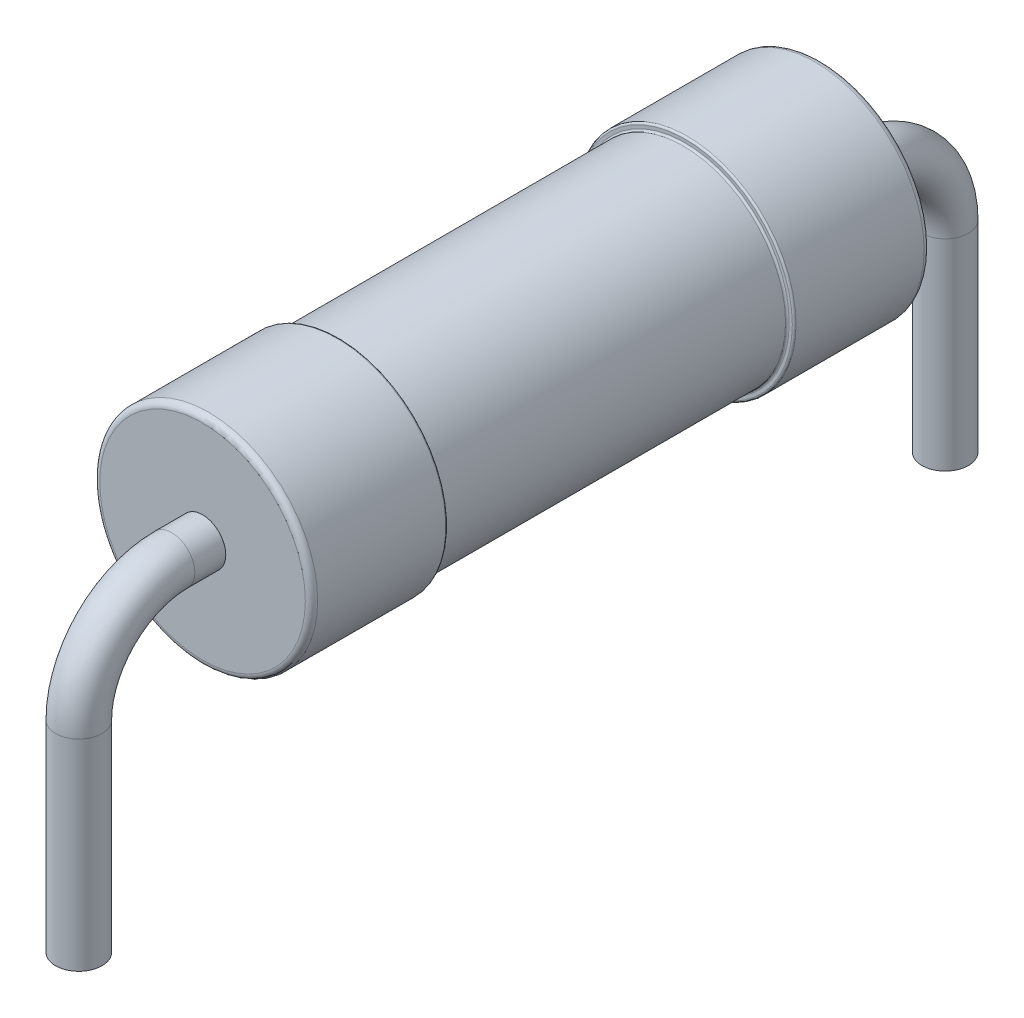
ISO-10303-21;
HEADER;
FILE_DESCRIPTION(('STEP AP214'),'2;1');
FILE_NAME('part.step','',(''),(''),'','','');
FILE_SCHEMA(('AUTOMOTIVE_DESIGN { 1 0 10303 214 1 1 1 1 }'));
ENDSEC;
DATA;
#1=APPLICATION_CONTEXT('core data for automotive mechanical design processes');
#2=APPLICATION_PROTOCOL_DEFINITION('international standard','automotive_design',2000,#1);
#3=PRODUCT_CONTEXT('',#1,'mechanical');
#4=PRODUCT('Part','Part','',(#3));
#5=PRODUCT_RELATED_PRODUCT_CATEGORY('part','',(#4));
#6=PRODUCT_DEFINITION_FORMATION('','',#4);
#7=PRODUCT_DEFINITION_CONTEXT('part definition',#1,'design');
#8=PRODUCT_DEFINITION('design','',#6,#7);
#9=PRODUCT_DEFINITION_SHAPE('','',#8);
#10=(LENGTH_UNIT() NAMED_UNIT(*) SI_UNIT(.MILLI.,.METRE.));
#11=(NAMED_UNIT(*) PLANE_ANGLE_UNIT() SI_UNIT($,.RADIAN.));
#12=(NAMED_UNIT(*) SI_UNIT($,.STERADIAN.) SOLID_ANGLE_UNIT());
#13=UNCERTAINTY_MEASURE_WITH_UNIT(LENGTH_MEASURE(1.E-05),#10,'distance_accuracy_value','');
#14=(GEOMETRIC_REPRESENTATION_CONTEXT(3) GLOBAL_UNCERTAINTY_ASSIGNED_CONTEXT((#13)) GLOBAL_UNIT_ASSIGNED_CONTEXT((#10,
#11,#12)) REPRESENTATION_CONTEXT('',''));
#15=CARTESIAN_POINT('',(0.,0.,0.));
#16=DIRECTION('',(0.,0.,1.));
#17=DIRECTION('',(1.,0.,0.));
#18=AXIS2_PLACEMENT_3D('',#15,#16,#17);
#19=CARTESIAN_POINT('',(0.,0.,5.));
#20=DIRECTION('',(0.,0.,-1.));
#21=DIRECTION('',(-1.,0.,0.));
#22=AXIS2_PLACEMENT_3D('',#19,#20,#21);
#23=CYLINDRICAL_SURFACE('',#22,1.76);
#24=CARTESIAN_POINT('',(0.,0.,2.83));
#25=DIRECTION('',(0.,0.,-1.));
#26=DIRECTION('',(-1.,0.,0.));
#27=AXIS2_PLACEMENT_3D('',#24,#25,#26);
#28=CIRCLE('',#27,1.76);
#29=CARTESIAN_POINT('',(-1.76,0.,2.83));
#30=VERTEX_POINT('',#29);
#31=EDGE_CURVE('E55',#30,#30,#28,.F.);
#32=ORIENTED_EDGE('',*,*,#31,.T.);
#33=EDGE_LOOP('',(#32));
#34=FACE_BOUND('',#33,.T.);
#35=CARTESIAN_POINT('',(0.,0.,4.9));
#36=DIRECTION('',(0.,0.,1.));
#37=DIRECTION('',(1.,0.,0.));
#38=AXIS2_PLACEMENT_3D('',#35,#36,#37);
#39=CIRCLE('',#38,1.76);
#40=CARTESIAN_POINT('',(1.76,0.,4.9));
#41=VERTEX_POINT('',#40);
#42=EDGE_CURVE('E83',#41,#41,#39,.F.);
#43=ORIENTED_EDGE('',*,*,#42,.T.);
#44=EDGE_LOOP('',(#43));
#45=FACE_BOUND('',#44,.T.);
#46=ADVANCED_FACE('F48',(#34,#45),#23,.T.);
#47=CARTESIAN_POINT('',(0.,0.,5.));
#48=DIRECTION('',(0.,0.,1.));
#49=DIRECTION('',(1.,0.,0.));
#50=AXIS2_PLACEMENT_3D('',#47,#48,#49);
#51=PLANE('',#50);
#52=CARTESIAN_POINT('',(0.,0.,5.));
#53=DIRECTION('',(0.,0.,1.));
#54=DIRECTION('',(1.,0.,0.));
#55=AXIS2_PLACEMENT_3D('',#52,#53,#54);
#56=CIRCLE('',#55,0.375);
#57=CARTESIAN_POINT('',(0.375,0.,5.));
#58=VERTEX_POINT('',#57);
#59=EDGE_CURVE('E95',#58,#58,#56,.F.);
#60=ORIENTED_EDGE('',*,*,#59,.T.);
#61=EDGE_LOOP('',(#60));
#62=FACE_BOUND('',#61,.T.);
#63=CARTESIAN_POINT('',(0.,0.,5.));
#64=DIRECTION('',(0.,0.,1.));
#65=DIRECTION('',(1.,0.,0.));
#66=AXIS2_PLACEMENT_3D('',#63,#64,#65);
#67=CIRCLE('',#66,1.66);
#68=CARTESIAN_POINT('',(1.66,0.,5.));
#69=VERTEX_POINT('',#68);
#70=EDGE_CURVE('E86',#69,#69,#67,.T.);
#71=ORIENTED_EDGE('',*,*,#70,.T.);
#72=EDGE_LOOP('',(#71));
#73=FACE_BOUND('',#72,.T.);
#74=ADVANCED_FACE('F134',(#62,#73),#51,.T.);
#75=CARTESIAN_POINT('',(0.,2.59634607125077,2.8));
#76=DIRECTION('',(0.,0.,-1.));
#77=DIRECTION('',(-1.,0.,0.));
#78=AXIS2_PLACEMENT_3D('',#75,#76,#77);
#79=PLANE('',#78);
#80=CARTESIAN_POINT('',(0.,0.,2.8));
#81=DIRECTION('',(0.,0.,-1.));
#82=DIRECTION('',(-1.,0.,0.));
#83=AXIS2_PLACEMENT_3D('',#80,#81,#82);
#84=CIRCLE('',#83,1.68);
#85=CARTESIAN_POINT('',(-1.68,0.,2.8));
#86=VERTEX_POINT('',#85);
#87=EDGE_CURVE('E59',#86,#86,#84,.F.);
#88=ORIENTED_EDGE('',*,*,#87,.T.);
#89=EDGE_LOOP('',(#88));
#90=FACE_BOUND('',#89,.T.);
#91=CARTESIAN_POINT('',(0.,0.,2.8));
#92=DIRECTION('',(0.,0.,-1.));
#93=DIRECTION('',(-1.,0.,0.));
#94=AXIS2_PLACEMENT_3D('',#91,#92,#93);
#95=CIRCLE('',#94,1.73);
#96=CARTESIAN_POINT('',(-1.73,0.,2.8));
#97=VERTEX_POINT('',#96);
#98=EDGE_CURVE('E63',#97,#97,#95,.T.);
#99=ORIENTED_EDGE('',*,*,#98,.T.);
#100=EDGE_LOOP('',(#99));
#101=FACE_BOUND('',#100,.T.);
#102=ADVANCED_FACE('F142',(#90,#101),#79,.T.);
#103=CARTESIAN_POINT('',(0.,2.59634607125077,-2.8));
#104=DIRECTION('',(0.,0.,1.));
#105=DIRECTION('',(1.,0.,0.));
#106=AXIS2_PLACEMENT_3D('',#103,#104,#105);
#107=PLANE('',#106);
#108=CARTESIAN_POINT('',(0.,0.,-2.8));
#109=DIRECTION('',(0.,0.,1.));
#110=DIRECTION('',(1.,0.,0.));
#111=AXIS2_PLACEMENT_3D('',#108,#109,#110);
#112=CIRCLE('',#111,1.73);
#113=CARTESIAN_POINT('',(1.73,0.,-2.8));
#114=VERTEX_POINT('',#113);
#115=EDGE_CURVE('E77',#114,#114,#112,.T.);
#116=ORIENTED_EDGE('',*,*,#115,.T.);
#117=EDGE_LOOP('',(#116));
#118=FACE_BOUND('',#117,.T.);
#119=CARTESIAN_POINT('',(0.,0.,-2.8));
#120=DIRECTION('',(0.,0.,1.));
#121=DIRECTION('',(1.,0.,0.));
#122=AXIS2_PLACEMENT_3D('',#119,#120,#121);
#123=CIRCLE('',#122,1.68);
#124=CARTESIAN_POINT('',(1.68,0.,-2.8));
#125=VERTEX_POINT('',#124);
#126=EDGE_CURVE('E80',#125,#125,#123,.F.);
#127=ORIENTED_EDGE('',*,*,#126,.T.);
#128=EDGE_LOOP('',(#127));
#129=FACE_BOUND('',#128,.T.);
#130=ADVANCED_FACE('F173',(#118,#129),#107,.T.);
#131=CARTESIAN_POINT('',(0.,0.,6.40046315614743));
#132=DIRECTION('',(0.,0.,1.));
#133=DIRECTION('',(1.,0.,0.));
#134=AXIS2_PLACEMENT_3D('',#131,#132,#133);
#135=CYLINDRICAL_SURFACE('',#134,1.65);
#136=CARTESIAN_POINT('',(0.,0.,-2.77));
#137=DIRECTION('',(0.,0.,1.));
#138=DIRECTION('',(1.,0.,0.));
#139=AXIS2_PLACEMENT_3D('',#136,#137,#138);
#140=CIRCLE('',#139,1.65);
#141=CARTESIAN_POINT('',(1.65,0.,-2.77));
#142=VERTEX_POINT('',#141);
#143=EDGE_CURVE('E68',#142,#142,#140,.T.);
#144=ORIENTED_EDGE('',*,*,#143,.T.);
#145=EDGE_LOOP('',(#144));
#146=FACE_BOUND('',#145,.T.);
#147=CARTESIAN_POINT('',(0.,0.,2.77));
#148=DIRECTION('',(0.,0.,-1.));
#149=DIRECTION('',(-1.,0.,0.));
#150=AXIS2_PLACEMENT_3D('',#147,#148,#149);
#151=CIRCLE('',#150,1.65);
#152=CARTESIAN_POINT('',(-1.65,0.,2.77));
#153=VERTEX_POINT('',#152);
#154=EDGE_CURVE('E71',#153,#153,#151,.T.);
#155=ORIENTED_EDGE('',*,*,#154,.T.);
#156=EDGE_LOOP('',(#155));
#157=FACE_BOUND('',#156,.T.);
#158=ADVANCED_FACE('F160',(#146,#157),#135,.T.);
#159=CARTESIAN_POINT('',(0.,0.,-5.));
#160=DIRECTION('',(0.,0.,1.));
#161=DIRECTION('',(1.,0.,0.));
#162=AXIS2_PLACEMENT_3D('',#159,#160,#161);
#163=PLANE('',#162);
#164=CARTESIAN_POINT('',(0.,0.,-5.));
#165=DIRECTION('',(0.,0.,1.));
#166=DIRECTION('',(1.,0.,0.));
#167=AXIS2_PLACEMENT_3D('',#164,#165,#166);
#168=CIRCLE('',#167,0.375);
#169=CARTESIAN_POINT('',(0.375,0.,-5.));
#170=VERTEX_POINT('',#169);
#171=EDGE_CURVE('E11',#170,#170,#168,.F.);
#172=ORIENTED_EDGE('',*,*,#171,.F.);
#173=EDGE_LOOP('',(#172));
#174=FACE_BOUND('',#173,.T.);
#175=CARTESIAN_POINT('',(0.,0.,-5.));
#176=DIRECTION('',(0.,0.,1.));
#177=DIRECTION('',(1.,0.,0.));
#178=AXIS2_PLACEMENT_3D('',#175,#176,#177);
#179=CIRCLE('',#178,1.66);
#180=CARTESIAN_POINT('',(1.66,0.,-5.));
#181=VERTEX_POINT('',#180);
#182=EDGE_CURVE('E89',#181,#181,#179,.F.);
#183=ORIENTED_EDGE('',*,*,#182,.T.);
#184=EDGE_LOOP('',(#183));
#185=FACE_BOUND('',#184,.T.);
#186=ADVANCED_FACE('F150',(#174,#185),#163,.F.);
#187=CARTESIAN_POINT('',(0.,0.,-2.83));
#188=DIRECTION('',(0.,0.,1.));
#189=DIRECTION('',(1.,0.,0.));
#190=AXIS2_PLACEMENT_3D('',#187,#188,#189);
#191=CIRCLE('',#190,1.76);
#192=CARTESIAN_POINT('',(1.76,0.,-2.83));
#193=VERTEX_POINT('',#192);
#194=EDGE_CURVE('E74',#193,#193,#191,.F.);
#195=ORIENTED_EDGE('',*,*,#194,.T.);
#196=EDGE_LOOP('',(#195));
#197=FACE_BOUND('',#196,.T.);
#198=CARTESIAN_POINT('',(0.,0.,-4.9));
#199=DIRECTION('',(0.,0.,1.));
#200=DIRECTION('',(1.,0.,0.));
#201=AXIS2_PLACEMENT_3D('',#198,#199,#200);
#202=CIRCLE('',#201,1.76);
#203=CARTESIAN_POINT('',(1.76,0.,-4.9));
#204=VERTEX_POINT('',#203);
#205=EDGE_CURVE('E92',#204,#204,#202,.T.);
#206=ORIENTED_EDGE('',*,*,#205,.T.);
#207=EDGE_LOOP('',(#206));
#208=FACE_BOUND('',#207,.T.);
#209=ADVANCED_FACE('F136',(#197,#208),#23,.T.);
#210=CARTESIAN_POINT('',(0.,0.,-4.9));
#211=DIRECTION('',(0.,0.,1.));
#212=DIRECTION('',(1.,0.,0.));
#213=AXIS2_PLACEMENT_3D('',#210,#211,#212);
#214=TOROIDAL_SURFACE('',#213,1.66,0.1);
#215=ORIENTED_EDGE('',*,*,#182,.F.);
#216=EDGE_LOOP('',(#215));
#217=FACE_BOUND('',#216,.T.);
#218=ORIENTED_EDGE('',*,*,#205,.F.);
#219=EDGE_LOOP('',(#218));
#220=FACE_BOUND('',#219,.T.);
#221=ADVANCED_FACE('F149',(#217,#220),#214,.T.);
#222=CARTESIAN_POINT('',(0.,0.,4.9));
#223=DIRECTION('',(0.,0.,1.));
#224=DIRECTION('',(1.,0.,0.));
#225=AXIS2_PLACEMENT_3D('',#222,#223,#224);
#226=TOROIDAL_SURFACE('',#225,1.66,0.1);
#227=ORIENTED_EDGE('',*,*,#42,.F.);
#228=EDGE_LOOP('',(#227));
#229=FACE_BOUND('',#228,.T.);
#230=ORIENTED_EDGE('',*,*,#70,.F.);
#231=EDGE_LOOP('',(#230));
#232=FACE_BOUND('',#231,.T.);
#233=ADVANCED_FACE('F157',(#229,#232),#226,.T.);
#234=CARTESIAN_POINT('',(0.,0.,-2.83));
#235=DIRECTION('',(0.,0.,1.));
#236=DIRECTION('',(1.,0.,0.));
#237=AXIS2_PLACEMENT_3D('',#234,#235,#236);
#238=TOROIDAL_SURFACE('',#237,1.73,0.03);
#239=ORIENTED_EDGE('',*,*,#194,.F.);
#240=EDGE_LOOP('',(#239));
#241=FACE_BOUND('',#240,.T.);
#242=ORIENTED_EDGE('',*,*,#115,.F.);
#243=EDGE_LOOP('',(#242));
#244=FACE_BOUND('',#243,.T.);
#245=ADVANCED_FACE('F167',(#241,#244),#238,.T.);
#246=CARTESIAN_POINT('',(0.,0.,-2.77));
#247=DIRECTION('',(0.,0.,1.));
#248=DIRECTION('',(1.,0.,0.));
#249=AXIS2_PLACEMENT_3D('',#246,#247,#248);
#250=TOROIDAL_SURFACE('',#249,1.68,0.03);
#251=ORIENTED_EDGE('',*,*,#126,.F.);
#252=EDGE_LOOP('',(#251));
#253=FACE_BOUND('',#252,.T.);
#254=ORIENTED_EDGE('',*,*,#143,.F.);
#255=EDGE_LOOP('',(#254));
#256=FACE_BOUND('',#255,.T.);
#257=ADVANCED_FACE('F169',(#253,#256),#250,.F.);
#258=CARTESIAN_POINT('',(0.,0.,2.77));
#259=DIRECTION('',(0.,0.,-1.));
#260=DIRECTION('',(-1.,0.,0.));
#261=AXIS2_PLACEMENT_3D('',#258,#259,#260);
#262=TOROIDAL_SURFACE('',#261,1.68,0.03);
#263=ORIENTED_EDGE('',*,*,#154,.F.);
#264=EDGE_LOOP('',(#263));
#265=FACE_BOUND('',#264,.T.);
#266=ORIENTED_EDGE('',*,*,#87,.F.);
#267=EDGE_LOOP('',(#266));
#268=FACE_BOUND('',#267,.T.);
#269=ADVANCED_FACE('F181',(#265,#268),#262,.F.);
#270=CARTESIAN_POINT('',(0.,0.,2.83));
#271=DIRECTION('',(0.,0.,-1.));
#272=DIRECTION('',(-1.,0.,0.));
#273=AXIS2_PLACEMENT_3D('',#270,#271,#272);
#274=TOROIDAL_SURFACE('',#273,1.73,0.03);
#275=ORIENTED_EDGE('',*,*,#31,.F.);
#276=EDGE_LOOP('',(#275));
#277=FACE_BOUND('',#276,.T.);
#278=ORIENTED_EDGE('',*,*,#98,.F.);
#279=EDGE_LOOP('',(#278));
#280=FACE_BOUND('',#279,.T.);
#281=ADVANCED_FACE('F50',(#277,#280),#274,.T.);
#282=CARTESIAN_POINT('',(0.,0.,5.5));
#283=DIRECTION('',(0.,0.,-1.));
#284=DIRECTION('',(-1.,0.,0.));
#285=AXIS2_PLACEMENT_3D('',#282,#283,#284);
#286=CYLINDRICAL_SURFACE('',#285,0.375);
#287=CARTESIAN_POINT('',(0.,0.,-5.5));
#288=DIRECTION('',(0.,0.,-1.));
#289=DIRECTION('',(-1.,0.,0.));
#290=AXIS2_PLACEMENT_3D('',#287,#288,#289);
#291=CIRCLE('',#290,0.375);
#292=CARTESIAN_POINT('',(0.,0.375,-5.5));
#293=VERTEX_POINT('',#292);
#294=EDGE_CURVE('E107',#293,#293,#291,.T.);
#295=ORIENTED_EDGE('',*,*,#294,.F.);
#296=EDGE_LOOP('',(#295));
#297=FACE_BOUND('',#296,.T.);
#298=ORIENTED_EDGE('',*,*,#171,.T.);
#299=EDGE_LOOP('',(#298));
#300=FACE_BOUND('',#299,.T.);
#301=ADVANCED_FACE('F198',(#297,#300),#286,.T.);
#302=ORIENTED_EDGE('',*,*,#59,.F.);
#303=EDGE_LOOP('',(#302));
#304=FACE_BOUND('',#303,.T.);
#305=CARTESIAN_POINT('',(0.,0.,5.5));
#306=DIRECTION('',(0.,0.,1.));
#307=DIRECTION('',(1.,0.,0.));
#308=AXIS2_PLACEMENT_3D('',#305,#306,#307);
#309=CIRCLE('',#308,0.375);
#310=CARTESIAN_POINT('',(0.,0.375,5.5));
#311=VERTEX_POINT('',#310);
#312=EDGE_CURVE('E98',#311,#311,#309,.T.);
#313=ORIENTED_EDGE('',*,*,#312,.F.);
#314=EDGE_LOOP('',(#313));
#315=FACE_BOUND('',#314,.T.);
#316=ADVANCED_FACE('F203',(#304,#315),#286,.T.);
#317=CARTESIAN_POINT('',(0.,-4.75,7.));
#318=DIRECTION('',(0.,-1.,0.));
#319=DIRECTION('',(1.,0.,0.));
#320=AXIS2_PLACEMENT_3D('',#317,#318,#319);
#321=PLANE('',#320);
#322=CARTESIAN_POINT('',(0.,-4.75,7.));
#323=DIRECTION('',(0.,-1.,0.));
#324=DIRECTION('',(1.,0.,0.));
#325=AXIS2_PLACEMENT_3D('',#322,#323,#324);
#326=CIRCLE('',#325,0.375);
#327=CARTESIAN_POINT('',(0.375,-4.75,7.));
#328=VERTEX_POINT('',#327);
#329=EDGE_CURVE('E104',#328,#328,#326,.T.);
#330=ORIENTED_EDGE('',*,*,#329,.T.);
#331=EDGE_LOOP('',(#330));
#332=FACE_BOUND('',#331,.T.);
#333=ADVANCED_FACE('F130',(#332),#321,.T.);
#334=CARTESIAN_POINT('',(0.,-4.75,7.));
#335=DIRECTION('',(0.,1.,0.));
#336=DIRECTION('',(0.,0.,1.));
#337=AXIS2_PLACEMENT_3D('',#334,#335,#336);
#338=CYLINDRICAL_SURFACE('',#337,0.375);
#339=CARTESIAN_POINT('',(0.,-1.5,7.));
#340=DIRECTION('',(0.,-1.,0.));
#341=DIRECTION('',(1.,0.,0.));
#342=AXIS2_PLACEMENT_3D('',#339,#340,#341);
#343=CIRCLE('',#342,0.375);
#344=CARTESIAN_POINT('',(0.,-1.5,7.375));
#345=VERTEX_POINT('',#344);
#346=EDGE_CURVE('E101',#345,#345,#343,.T.);
#347=ORIENTED_EDGE('',*,*,#346,.T.);
#348=EDGE_LOOP('',(#347));
#349=FACE_BOUND('',#348,.T.);
#350=ORIENTED_EDGE('',*,*,#329,.F.);
#351=EDGE_LOOP('',(#350));
#352=FACE_BOUND('',#351,.T.);
#353=ADVANCED_FACE('F215',(#349,#352),#338,.T.);
#354=CARTESIAN_POINT('',(0.,-1.5,5.5));
#355=DIRECTION('',(-1.,0.,0.));
#356=DIRECTION('',(0.,0.,1.));
#357=AXIS2_PLACEMENT_3D('',#354,#355,#356);
#358=TOROIDAL_SURFACE('',#357,1.5,0.375);
#359=CARTESIAN_POINT('',(0.,-1.5,5.5));
#360=DIRECTION('',(-1.,0.,0.));
#361=DIRECTION('',(0.,0.,1.));
#362=AXIS2_PLACEMENT_3D('',#359,#360,#361);
#363=CIRCLE('',#362,1.875);
#364=EDGE_CURVE('',#345,#311,#363,.T.);
#365=ORIENTED_EDGE('',*,*,#346,.F.);
#366=ORIENTED_EDGE('',*,*,#312,.T.);
#367=ORIENTED_EDGE('',*,*,#364,.T.);
#368=ORIENTED_EDGE('',*,*,#364,.F.);
#369=EDGE_LOOP('',(#365,#367,#366,#368));
#370=FACE_BOUND('',#369,.T.);
#371=ADVANCED_FACE('F131',(#370),#358,.T.);
#372=CARTESIAN_POINT('',(0.,-4.75,-7.));
#373=DIRECTION('',(0.,-1.,0.));
#374=DIRECTION('',(-1.,0.,0.));
#375=AXIS2_PLACEMENT_3D('',#372,#373,#374);
#376=PLANE('',#375);
#377=CARTESIAN_POINT('',(0.,-4.75,-7.));
#378=DIRECTION('',(0.,-1.,0.));
#379=DIRECTION('',(-1.,0.,0.));
#380=AXIS2_PLACEMENT_3D('',#377,#378,#379);
#381=CIRCLE('',#380,0.375);
#382=CARTESIAN_POINT('',(-0.375,-4.75,-7.));
#383=VERTEX_POINT('',#382);
#384=EDGE_CURVE('E113',#383,#383,#381,.T.);
#385=ORIENTED_EDGE('',*,*,#384,.T.);
#386=EDGE_LOOP('',(#385));
#387=FACE_BOUND('',#386,.T.);
#388=ADVANCED_FACE('F117',(#387),#376,.T.);
#389=CARTESIAN_POINT('',(0.,-4.75,-7.));
#390=DIRECTION('',(0.,1.,0.));
#391=DIRECTION('',(0.,0.,1.));
#392=AXIS2_PLACEMENT_3D('',#389,#390,#391);
#393=CYLINDRICAL_SURFACE('',#392,0.375);
#394=CARTESIAN_POINT('',(0.,-1.5,-7.));
#395=DIRECTION('',(0.,-1.,0.));
#396=DIRECTION('',(-1.,0.,0.));
#397=AXIS2_PLACEMENT_3D('',#394,#395,#396);
#398=CIRCLE('',#397,0.375);
#399=CARTESIAN_POINT('',(0.,-1.5,-7.375));
#400=VERTEX_POINT('',#399);
#401=EDGE_CURVE('E110',#400,#400,#398,.T.);
#402=ORIENTED_EDGE('',*,*,#401,.T.);
#403=EDGE_LOOP('',(#402));
#404=FACE_BOUND('',#403,.T.);
#405=ORIENTED_EDGE('',*,*,#384,.F.);
#406=EDGE_LOOP('',(#405));
#407=FACE_BOUND('',#406,.T.);
#408=ADVANCED_FACE('F119',(#404,#407),#393,.T.);
#409=CARTESIAN_POINT('',(0.,-1.5,-5.5));
#410=DIRECTION('',(1.,0.,0.));
#411=DIRECTION('',(0.,0.,-1.));
#412=AXIS2_PLACEMENT_3D('',#409,#410,#411);
#413=TOROIDAL_SURFACE('',#412,1.5,0.375);
#414=CARTESIAN_POINT('',(0.,-1.5,-5.5));
#415=DIRECTION('',(1.,0.,0.));
#416=DIRECTION('',(0.,0.,-1.));
#417=AXIS2_PLACEMENT_3D('',#414,#415,#416);
#418=CIRCLE('',#417,1.875);
#419=EDGE_CURVE('',#400,#293,#418,.T.);
#420=ORIENTED_EDGE('',*,*,#401,.F.);
#421=ORIENTED_EDGE('',*,*,#294,.T.);
#422=ORIENTED_EDGE('',*,*,#419,.T.);
#423=ORIENTED_EDGE('',*,*,#419,.F.);
#424=EDGE_LOOP('',(#420,#422,#421,#423));
#425=FACE_BOUND('',#424,.T.);
#426=ADVANCED_FACE('F121',(#425),#413,.T.);
#427=CLOSED_SHELL('',(#46,#74,#102,#130,#158,#186,#209,#221,#233,#245,#257,#269,#281,#301,#316,
#333,#353,#371,#388,#408,#426));
#428=MANIFOLD_SOLID_BREP('B2',#427);
#429=ADVANCED_BREP_SHAPE_REPRESENTATION('',(#18,#428),#14);
#430=SHAPE_DEFINITION_REPRESENTATION(#9,#429);
ENDSEC;
END-ISO-10303-21;
